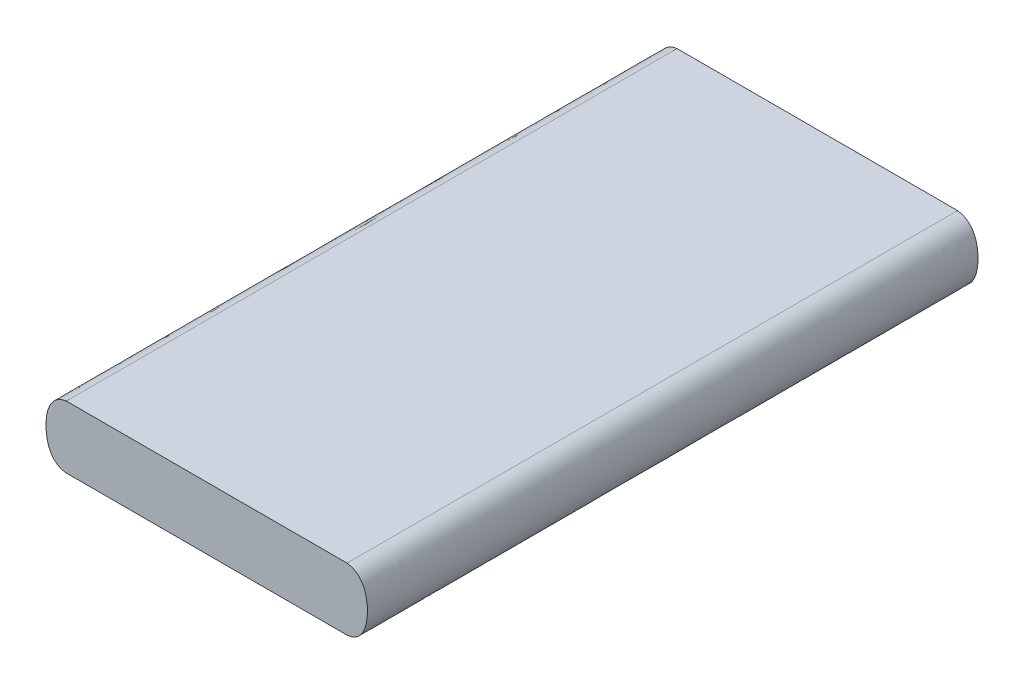
ISO-10303-21;
HEADER;
FILE_DESCRIPTION(('STEP AP214'),'2;1');
FILE_NAME('part.step','',(''),(''),'','','');
FILE_SCHEMA(('AUTOMOTIVE_DESIGN { 1 0 10303 214 1 1 1 1 }'));
ENDSEC;
DATA;
#1=APPLICATION_CONTEXT('core data for automotive mechanical design processes');
#2=APPLICATION_PROTOCOL_DEFINITION('international standard','automotive_design',2000,#1);
#3=PRODUCT_CONTEXT('',#1,'mechanical');
#4=PRODUCT('Part','Part','',(#3));
#5=PRODUCT_RELATED_PRODUCT_CATEGORY('part','',(#4));
#6=PRODUCT_DEFINITION_FORMATION('','',#4);
#7=PRODUCT_DEFINITION_CONTEXT('part definition',#1,'design');
#8=PRODUCT_DEFINITION('design','',#6,#7);
#9=PRODUCT_DEFINITION_SHAPE('','',#8);
#10=(LENGTH_UNIT() NAMED_UNIT(*) SI_UNIT(.MILLI.,.METRE.));
#11=(NAMED_UNIT(*) PLANE_ANGLE_UNIT() SI_UNIT($,.RADIAN.));
#12=(NAMED_UNIT(*) SI_UNIT($,.STERADIAN.) SOLID_ANGLE_UNIT());
#13=UNCERTAINTY_MEASURE_WITH_UNIT(LENGTH_MEASURE(1.E-05),#10,'distance_accuracy_value','');
#14=(GEOMETRIC_REPRESENTATION_CONTEXT(3) GLOBAL_UNCERTAINTY_ASSIGNED_CONTEXT((#13)) GLOBAL_UNIT_ASSIGNED_CONTEXT((#10,
#11,#12)) REPRESENTATION_CONTEXT('',''));
#15=CARTESIAN_POINT('',(0.,0.,0.));
#16=DIRECTION('',(0.,0.,1.));
#17=DIRECTION('',(1.,0.,0.));
#18=AXIS2_PLACEMENT_3D('',#15,#16,#17);
#19=CARTESIAN_POINT('',(4.74288308496042,14.5,142.));
#20=CARTESIAN_POINT('',(1.2301514416193,14.0495446700163,142.));
#21=CARTESIAN_POINT('',(-1.22976663127241,7.34701285766401,142.));
#22=CARTESIAN_POINT('',(1.22938182092552,0.256429614655685,142.));
#23=CARTESIAN_POINT('',(4.74288308496043,0.,142.));
#24=B_SPLINE_CURVE_WITH_KNOTS('',3,(#19,#20,#21,#22,#23),.UNSPECIFIED.,.F.,.F.,(4,1,4),(0.,0.5,
1.),.UNSPECIFIED.);
#25=DIRECTION('',(0.,0.,-1.));
#26=VECTOR('',#25,1.);
#27=SURFACE_OF_LINEAR_EXTRUSION('',#24,#26);
#28=CARTESIAN_POINT('',(4.74288308496042,14.5,0.));
#29=CARTESIAN_POINT('',(1.2301514416193,14.0495446700163,0.));
#30=CARTESIAN_POINT('',(-1.22976663127241,7.34701285766401,0.));
#31=CARTESIAN_POINT('',(1.22938182092552,0.256429614655685,0.));
#32=CARTESIAN_POINT('',(4.74288308496043,0.,0.));
#33=B_SPLINE_CURVE_WITH_KNOTS('',3,(#28,#29,#30,#31,#32),.UNSPECIFIED.,.F.,.F.,(4,1,4),(0.,0.5,
1.),.UNSPECIFIED.);
#34=CARTESIAN_POINT('',(4.74288308496042,14.5,0.));
#35=VERTEX_POINT('',#34);
#36=CARTESIAN_POINT('',(4.74288308496043,0.,0.));
#37=VERTEX_POINT('',#36);
#38=EDGE_CURVE('E122',#35,#37,#33,.T.);
#39=ORIENTED_EDGE('',*,*,#38,.T.);
#40=DIRECTION('',(0.,0.,-1.));
#41=VECTOR('',#40,1.);
#42=CARTESIAN_POINT('',(4.74288308496043,0.,142.));
#43=LINE('',#42,#41);
#44=CARTESIAN_POINT('',(4.74288308496043,0.,142.));
#45=VERTEX_POINT('',#44);
#46=EDGE_CURVE('E11',#45,#37,#43,.T.);
#47=ORIENTED_EDGE('',*,*,#46,.F.);
#48=CARTESIAN_POINT('',(4.74288308496042,14.5,142.));
#49=VERTEX_POINT('',#48);
#50=EDGE_CURVE('E91',#49,#45,#24,.T.);
#51=ORIENTED_EDGE('',*,*,#50,.F.);
#52=DIRECTION('',(0.,0.,-1.));
#53=VECTOR('',#52,1.);
#54=CARTESIAN_POINT('',(4.74288308496042,14.5,142.));
#55=LINE('',#54,#53);
#56=EDGE_CURVE('E99',#49,#35,#55,.T.);
#57=ORIENTED_EDGE('',*,*,#56,.T.);
#58=EDGE_LOOP('',(#39,#47,#51,#57));
#59=FACE_BOUND('',#58,.T.);
#60=ADVANCED_FACE('F39',(#59),#27,.F.);
#61=CARTESIAN_POINT('',(4.74288308496043,0.,142.));
#62=DIRECTION('',(0.,1.,0.));
#63=DIRECTION('',(-1.,0.,0.));
#64=AXIS2_PLACEMENT_3D('',#61,#62,#63);
#65=PLANE('',#64);
#66=DIRECTION('',(1.,0.,0.));
#67=VECTOR('',#66,1.);
#68=CARTESIAN_POINT('',(4.74288308496043,0.,0.));
#69=LINE('',#68,#67);
#70=CARTESIAN_POINT('',(70.0071169150396,0.,0.));
#71=VERTEX_POINT('',#70);
#72=EDGE_CURVE('E95',#37,#71,#69,.T.);
#73=ORIENTED_EDGE('',*,*,#72,.T.);
#74=DIRECTION('',(0.,0.,-1.));
#75=VECTOR('',#74,1.);
#76=CARTESIAN_POINT('',(70.0071169150396,0.,142.));
#77=LINE('',#76,#75);
#78=CARTESIAN_POINT('',(70.0071169150396,0.,142.));
#79=VERTEX_POINT('',#78);
#80=EDGE_CURVE('E48',#79,#71,#77,.T.);
#81=ORIENTED_EDGE('',*,*,#80,.F.);
#82=DIRECTION('',(1.,0.,0.));
#83=VECTOR('',#82,1.);
#84=CARTESIAN_POINT('',(4.74288308496043,0.,142.));
#85=LINE('',#84,#83);
#86=EDGE_CURVE('E86',#45,#79,#85,.T.);
#87=ORIENTED_EDGE('',*,*,#86,.F.);
#88=ORIENTED_EDGE('',*,*,#46,.T.);
#89=EDGE_LOOP('',(#73,#81,#87,#88));
#90=FACE_BOUND('',#89,.T.);
#91=ADVANCED_FACE('F94',(#90),#65,.F.);
#92=CARTESIAN_POINT('',(70.0071169150396,0.,142.));
#93=CARTESIAN_POINT('',(73.5206181790745,0.256429614655685,142.));
#94=CARTESIAN_POINT('',(75.9797666312724,7.34701285766401,142.));
#95=CARTESIAN_POINT('',(73.5198485583807,14.0495446700163,142.));
#96=CARTESIAN_POINT('',(70.0071169150396,14.5,142.));
#97=B_SPLINE_CURVE_WITH_KNOTS('',3,(#92,#93,#94,#95,#96),.UNSPECIFIED.,.F.,.F.,(4,1,4),(0.,0.5,
1.),.UNSPECIFIED.);
#98=DIRECTION('',(0.,0.,-1.));
#99=VECTOR('',#98,1.);
#100=SURFACE_OF_LINEAR_EXTRUSION('',#97,#99);
#101=CARTESIAN_POINT('',(70.0071169150396,0.,0.));
#102=CARTESIAN_POINT('',(73.5206181790745,0.256429614655685,0.));
#103=CARTESIAN_POINT('',(75.9797666312724,7.34701285766401,0.));
#104=CARTESIAN_POINT('',(73.5198485583807,14.0495446700163,0.));
#105=CARTESIAN_POINT('',(70.0071169150396,14.5,0.));
#106=B_SPLINE_CURVE_WITH_KNOTS('',3,(#101,#102,#103,#104,#105),.UNSPECIFIED.,.F.,.F.,(4,1,4),
(0.,0.5,1.),.UNSPECIFIED.);
#107=CARTESIAN_POINT('',(70.0071169150396,14.5,0.));
#108=VERTEX_POINT('',#107);
#109=EDGE_CURVE('E73',#71,#108,#106,.T.);
#110=ORIENTED_EDGE('',*,*,#109,.T.);
#111=DIRECTION('',(0.,0.,-1.));
#112=VECTOR('',#111,1.);
#113=CARTESIAN_POINT('',(70.0071169150396,14.5,142.));
#114=LINE('',#113,#112);
#115=CARTESIAN_POINT('',(70.0071169150396,14.5,142.));
#116=VERTEX_POINT('',#115);
#117=EDGE_CURVE('E96',#116,#108,#114,.T.);
#118=ORIENTED_EDGE('',*,*,#117,.F.);
#119=EDGE_CURVE('E89',#79,#116,#97,.T.);
#120=ORIENTED_EDGE('',*,*,#119,.F.);
#121=ORIENTED_EDGE('',*,*,#80,.T.);
#122=EDGE_LOOP('',(#110,#118,#120,#121));
#123=FACE_BOUND('',#122,.T.);
#124=ADVANCED_FACE('F97',(#123),#100,.F.);
#125=CARTESIAN_POINT('',(4.74288308496042,14.5,142.));
#126=DIRECTION('',(0.,-1.,0.));
#127=DIRECTION('',(0.,0.,-1.));
#128=AXIS2_PLACEMENT_3D('',#125,#126,#127);
#129=PLANE('',#128);
#130=DIRECTION('',(-1.,0.,0.));
#131=VECTOR('',#130,1.);
#132=CARTESIAN_POINT('',(4.74288308496042,14.5,0.));
#133=LINE('',#132,#131);
#134=EDGE_CURVE('E79',#108,#35,#133,.T.);
#135=ORIENTED_EDGE('',*,*,#134,.T.);
#136=ORIENTED_EDGE('',*,*,#56,.F.);
#137=DIRECTION('',(-1.,0.,0.));
#138=VECTOR('',#137,1.);
#139=CARTESIAN_POINT('',(4.74288308496042,14.5,142.));
#140=LINE('',#139,#138);
#141=EDGE_CURVE('E56',#116,#49,#140,.T.);
#142=ORIENTED_EDGE('',*,*,#141,.F.);
#143=ORIENTED_EDGE('',*,*,#117,.T.);
#144=EDGE_LOOP('',(#135,#136,#142,#143));
#145=FACE_BOUND('',#144,.T.);
#146=ADVANCED_FACE('F111',(#145),#129,.F.);
#147=CARTESIAN_POINT('',(0.,7.24999999999999,142.));
#148=DIRECTION('',(0.,0.,-1.));
#149=DIRECTION('',(-1.,0.,0.));
#150=AXIS2_PLACEMENT_3D('',#147,#148,#149);
#151=PLANE('',#150);
#152=ORIENTED_EDGE('',*,*,#50,.T.);
#153=ORIENTED_EDGE('',*,*,#86,.T.);
#154=ORIENTED_EDGE('',*,*,#119,.T.);
#155=ORIENTED_EDGE('',*,*,#141,.T.);
#156=EDGE_LOOP('',(#152,#153,#154,#155));
#157=FACE_BOUND('',#156,.T.);
#158=ADVANCED_FACE('F87',(#157),#151,.F.);
#159=CARTESIAN_POINT('',(0.,7.24999999999999,0.));
#160=DIRECTION('',(0.,0.,-1.));
#161=DIRECTION('',(-1.,0.,0.));
#162=AXIS2_PLACEMENT_3D('',#159,#160,#161);
#163=PLANE('',#162);
#164=ORIENTED_EDGE('',*,*,#38,.F.);
#165=ORIENTED_EDGE('',*,*,#134,.F.);
#166=ORIENTED_EDGE('',*,*,#109,.F.);
#167=ORIENTED_EDGE('',*,*,#72,.F.);
#168=EDGE_LOOP('',(#164,#165,#166,#167));
#169=FACE_BOUND('',#168,.T.);
#170=ADVANCED_FACE('F139',(#169),#163,.T.);
#171=CLOSED_SHELL('',(#60,#91,#124,#146,#158,#170));
#172=MANIFOLD_SOLID_BREP('B2',#171);
#173=ADVANCED_BREP_SHAPE_REPRESENTATION('',(#18,#172),#14);
#174=SHAPE_DEFINITION_REPRESENTATION(#9,#173);
ENDSEC;
END-ISO-10303-21;
